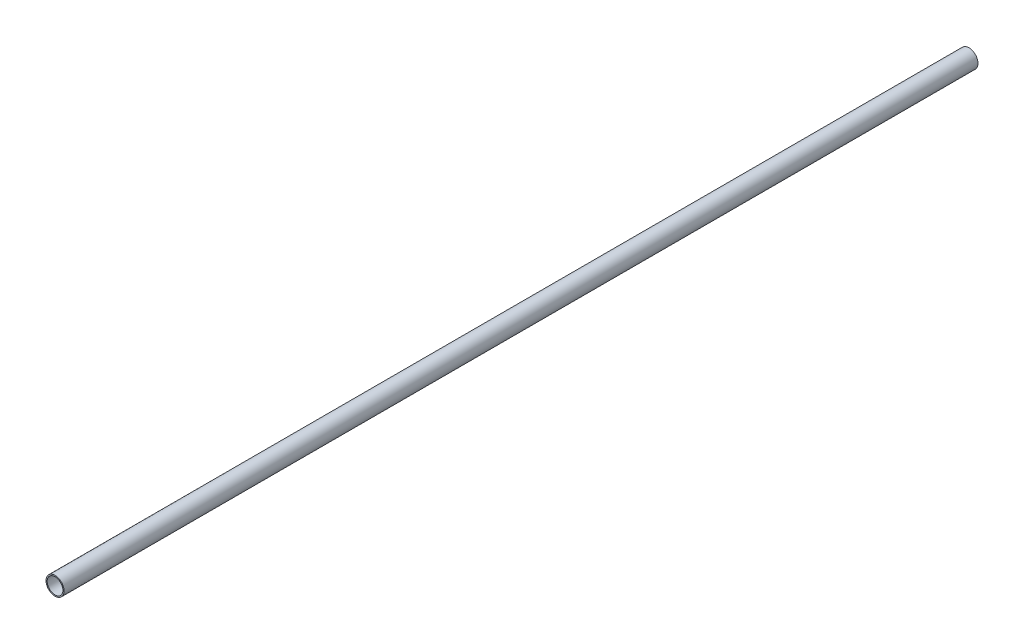
ISO-10303-21;
HEADER;
FILE_DESCRIPTION(('STEP AP214'),'2;1');
FILE_NAME('part.step','',(''),(''),'','','');
FILE_SCHEMA(('AUTOMOTIVE_DESIGN { 1 0 10303 214 1 1 1 1 }'));
ENDSEC;
DATA;
#1=APPLICATION_CONTEXT('core data for automotive mechanical design processes');
#2=APPLICATION_PROTOCOL_DEFINITION('international standard','automotive_design',2000,#1);
#3=PRODUCT_CONTEXT('',#1,'mechanical');
#4=PRODUCT('Part','Part','',(#3));
#5=PRODUCT_RELATED_PRODUCT_CATEGORY('part','',(#4));
#6=PRODUCT_DEFINITION_FORMATION('','',#4);
#7=PRODUCT_DEFINITION_CONTEXT('part definition',#1,'design');
#8=PRODUCT_DEFINITION('design','',#6,#7);
#9=PRODUCT_DEFINITION_SHAPE('','',#8);
#10=(LENGTH_UNIT() NAMED_UNIT(*) SI_UNIT(.MILLI.,.METRE.));
#11=(NAMED_UNIT(*) PLANE_ANGLE_UNIT() SI_UNIT($,.RADIAN.));
#12=(NAMED_UNIT(*) SI_UNIT($,.STERADIAN.) SOLID_ANGLE_UNIT());
#13=UNCERTAINTY_MEASURE_WITH_UNIT(LENGTH_MEASURE(1.E-05),#10,'distance_accuracy_value','');
#14=(GEOMETRIC_REPRESENTATION_CONTEXT(3) GLOBAL_UNCERTAINTY_ASSIGNED_CONTEXT((#13)) GLOBAL_UNIT_ASSIGNED_CONTEXT((#10,
#11,#12)) REPRESENTATION_CONTEXT('',''));
#15=CARTESIAN_POINT('',(0.,0.,0.));
#16=DIRECTION('',(0.,0.,1.));
#17=DIRECTION('',(1.,0.,0.));
#18=AXIS2_PLACEMENT_3D('',#15,#16,#17);
#19=CARTESIAN_POINT('',(0.,0.,3048.));
#20=DIRECTION('',(0.,0.,1.));
#21=DIRECTION('',(1.,0.,0.));
#22=AXIS2_PLACEMENT_3D('',#19,#20,#21);
#23=PLANE('',#22);
#24=CARTESIAN_POINT('',(0.,0.,3048.));
#25=DIRECTION('',(0.,0.,1.));
#26=DIRECTION('',(1.,0.,0.));
#27=AXIS2_PLACEMENT_3D('',#24,#25,#26);
#28=CIRCLE('',#27,30.1625);
#29=CARTESIAN_POINT('',(30.1625,0.,3048.));
#30=VERTEX_POINT('',#29);
#31=EDGE_CURVE('E10',#30,#30,#28,.T.);
#32=ORIENTED_EDGE('',*,*,#31,.T.);
#33=EDGE_LOOP('',(#32));
#34=FACE_BOUND('',#33,.T.);
#35=CARTESIAN_POINT('',(0.,0.,3048.));
#36=DIRECTION('',(0.,0.,1.));
#37=DIRECTION('',(1.,0.,0.));
#38=AXIS2_PLACEMENT_3D('',#35,#36,#37);
#39=CIRCLE('',#38,26.2509);
#40=CARTESIAN_POINT('',(26.2509,0.,3048.));
#41=VERTEX_POINT('',#40);
#42=EDGE_CURVE('E54',#41,#41,#39,.T.);
#43=ORIENTED_EDGE('',*,*,#42,.F.);
#44=EDGE_LOOP('',(#43));
#45=FACE_BOUND('',#44,.T.);
#46=ADVANCED_FACE('F41',(#34,#45),#23,.T.);
#47=CARTESIAN_POINT('',(0.,0.,0.));
#48=DIRECTION('',(0.,0.,1.));
#49=DIRECTION('',(1.,0.,0.));
#50=AXIS2_PLACEMENT_3D('',#47,#48,#49);
#51=PLANE('',#50);
#52=CARTESIAN_POINT('',(0.,0.,0.));
#53=DIRECTION('',(0.,0.,1.));
#54=DIRECTION('',(1.,0.,0.));
#55=AXIS2_PLACEMENT_3D('',#52,#53,#54);
#56=CIRCLE('',#55,30.1625);
#57=CARTESIAN_POINT('',(30.1625,0.,0.));
#58=VERTEX_POINT('',#57);
#59=EDGE_CURVE('E45',#58,#58,#56,.T.);
#60=ORIENTED_EDGE('',*,*,#59,.F.);
#61=EDGE_LOOP('',(#60));
#62=FACE_BOUND('',#61,.T.);
#63=CARTESIAN_POINT('',(0.,0.,0.));
#64=DIRECTION('',(0.,0.,1.));
#65=DIRECTION('',(1.,0.,0.));
#66=AXIS2_PLACEMENT_3D('',#63,#64,#65);
#67=CIRCLE('',#66,26.2509);
#68=CARTESIAN_POINT('',(26.2509,0.,0.));
#69=VERTEX_POINT('',#68);
#70=EDGE_CURVE('E56',#69,#69,#67,.T.);
#71=ORIENTED_EDGE('',*,*,#70,.T.);
#72=EDGE_LOOP('',(#71));
#73=FACE_BOUND('',#72,.T.);
#74=ADVANCED_FACE('F68',(#62,#73),#51,.F.);
#75=CARTESIAN_POINT('',(0.,0.,3048.));
#76=DIRECTION('',(0.,0.,-1.));
#77=DIRECTION('',(-1.,0.,0.));
#78=AXIS2_PLACEMENT_3D('',#75,#76,#77);
#79=CYLINDRICAL_SURFACE('',#78,30.1625);
#80=ORIENTED_EDGE('',*,*,#31,.F.);
#81=EDGE_LOOP('',(#80));
#82=FACE_BOUND('',#81,.T.);
#83=ORIENTED_EDGE('',*,*,#59,.T.);
#84=EDGE_LOOP('',(#83));
#85=FACE_BOUND('',#84,.T.);
#86=ADVANCED_FACE('F43',(#82,#85),#79,.T.);
#87=CARTESIAN_POINT('',(0.,0.,3048.));
#88=DIRECTION('',(0.,0.,-1.));
#89=DIRECTION('',(-1.,0.,0.));
#90=AXIS2_PLACEMENT_3D('',#87,#88,#89);
#91=CYLINDRICAL_SURFACE('',#90,26.2509);
#92=ORIENTED_EDGE('',*,*,#42,.T.);
#93=EDGE_LOOP('',(#92));
#94=FACE_BOUND('',#93,.T.);
#95=ORIENTED_EDGE('',*,*,#70,.F.);
#96=EDGE_LOOP('',(#95));
#97=FACE_BOUND('',#96,.T.);
#98=ADVANCED_FACE('F64',(#94,#97),#91,.F.);
#99=CLOSED_SHELL('',(#46,#74,#86,#98));
#100=MANIFOLD_SOLID_BREP('B2',#99);
#101=ADVANCED_BREP_SHAPE_REPRESENTATION('',(#18,#100),#14);
#102=SHAPE_DEFINITION_REPRESENTATION(#9,#101);
ENDSEC;
END-ISO-10303-21;
